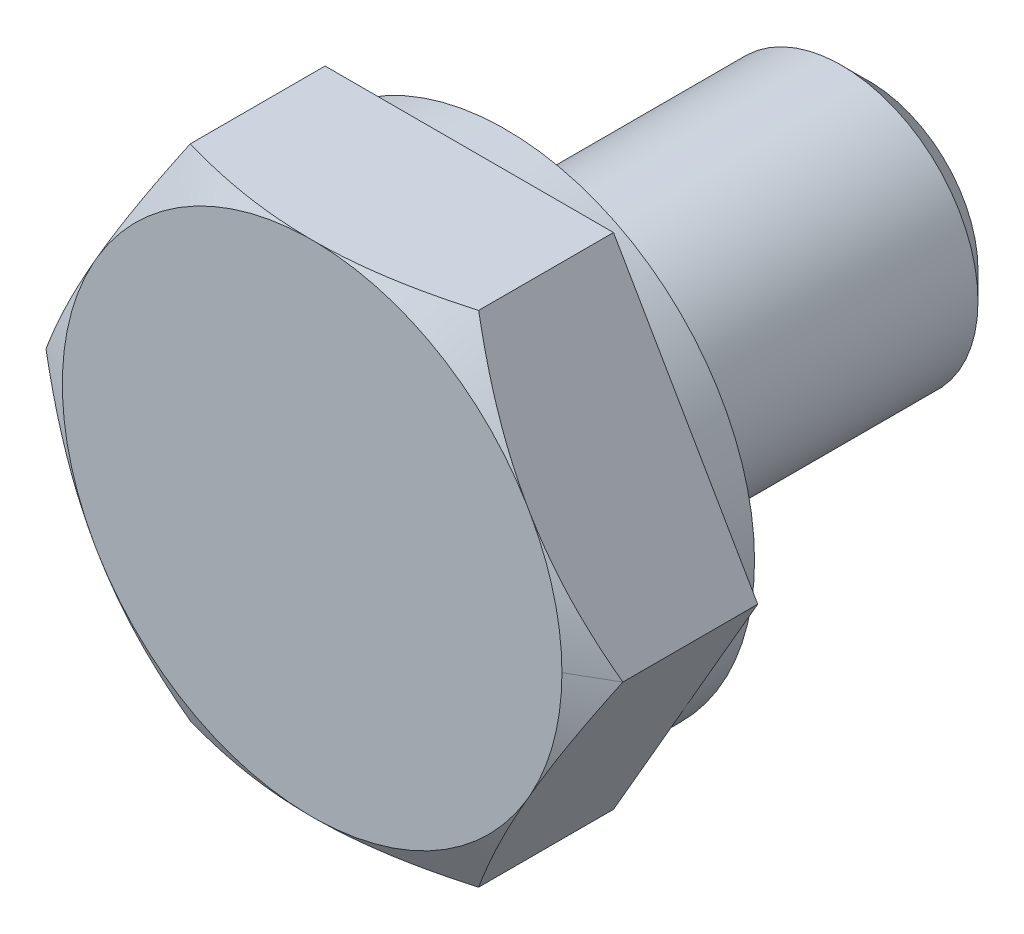
ISO-10303-21;
HEADER;
FILE_DESCRIPTION(('STEP AP214'),'2;1');
FILE_NAME('part.step','',(''),(''),'','','');
FILE_SCHEMA(('AUTOMOTIVE_DESIGN { 1 0 10303 214 1 1 1 1 }'));
ENDSEC;
DATA;
#1=APPLICATION_CONTEXT('core data for automotive mechanical design processes');
#2=APPLICATION_PROTOCOL_DEFINITION('international standard','automotive_design',2000,#1);
#3=PRODUCT_CONTEXT('',#1,'mechanical');
#4=PRODUCT('Part','Part','',(#3));
#5=PRODUCT_RELATED_PRODUCT_CATEGORY('part','',(#4));
#6=PRODUCT_DEFINITION_FORMATION('','',#4);
#7=PRODUCT_DEFINITION_CONTEXT('part definition',#1,'design');
#8=PRODUCT_DEFINITION('design','',#6,#7);
#9=PRODUCT_DEFINITION_SHAPE('','',#8);
#10=(LENGTH_UNIT() NAMED_UNIT(*) SI_UNIT(.MILLI.,.METRE.));
#11=(NAMED_UNIT(*) PLANE_ANGLE_UNIT() SI_UNIT($,.RADIAN.));
#12=(NAMED_UNIT(*) SI_UNIT($,.STERADIAN.) SOLID_ANGLE_UNIT());
#13=UNCERTAINTY_MEASURE_WITH_UNIT(LENGTH_MEASURE(1.E-05),#10,'distance_accuracy_value','');
#14=(GEOMETRIC_REPRESENTATION_CONTEXT(3) GLOBAL_UNCERTAINTY_ASSIGNED_CONTEXT((#13)) GLOBAL_UNIT_ASSIGNED_CONTEXT((#10,
#11,#12)) REPRESENTATION_CONTEXT('',''));
#15=CARTESIAN_POINT('',(0.,0.,0.));
#16=DIRECTION('',(0.,0.,1.));
#17=DIRECTION('',(1.,0.,0.));
#18=AXIS2_PLACEMENT_3D('',#15,#16,#17);
#19=CARTESIAN_POINT('',(0.,0.,2.13));
#20=DIRECTION('',(0.,0.,-1.));
#21=DIRECTION('',(1.,0.,0.));
#22=AXIS2_PLACEMENT_3D('',#19,#20,#21);
#23=CONICAL_SURFACE('',#22,2.75,1.047197551197);
#24=CARTESIAN_POINT('',(3.17500000000077,4.31876756579186E-13,1.88462613559356));
#25=CARTESIAN_POINT('',(2.76173272710988,-0.715799913751664,2.1232261068445));
#26=CARTESIAN_POINT('',(2.40378469547216,-1.33578409101713,2.12999999999952));
#27=(BOUNDED_CURVE() B_SPLINE_CURVE(2,(#24,#25,#26),.UNSPECIFIED.,.F.,
.F.) B_SPLINE_CURVE_WITH_KNOTS((3,3),(0.,1.),
.UNSPECIFIED.) CURVE() GEOMETRIC_REPRESENTATION_ITEM() RATIONAL_B_SPLINE_CURVE((1.,
1.03571044550834,1.)) REPRESENTATION_ITEM(''));
#28=CARTESIAN_POINT('',(3.175,0.,1.884626135594));
#29=VERTEX_POINT('',#28);
#30=CARTESIAN_POINT('',(2.403784695472,-1.335784091018,2.13));
#31=VERTEX_POINT('',#30);
#32=EDGE_CURVE('E268',#29,#31,#27,.T.);
#33=ORIENTED_EDGE('',*,*,#32,.F.);
#34=DIRECTION('',(0.866025403784329,0.,-0.50000000000019));
#35=VECTOR('',#34,1.);
#36=CARTESIAN_POINT('',(2.75,0.,2.13));
#37=LINE('',#36,#35);
#38=CARTESIAN_POINT('',(2.75,0.,2.13));
#39=VERTEX_POINT('',#38);
#40=EDGE_CURVE('E11',#39,#29,#37,.T.);
#41=ORIENTED_EDGE('',*,*,#40,.F.);
#42=CARTESIAN_POINT('',(0.,0.,2.13));
#43=DIRECTION('',(0.,0.,1.));
#44=DIRECTION('',(1.,0.,0.));
#45=AXIS2_PLACEMENT_3D('',#42,#43,#44);
#46=CIRCLE('',#45,2.75);
#47=EDGE_CURVE('E196',#31,#39,#46,.T.);
#48=ORIENTED_EDGE('',*,*,#47,.F.);
#49=EDGE_LOOP('',(#33,#41,#48));
#50=FACE_BOUND('',#49,.T.);
#51=ADVANCED_FACE('F16',(#50),#23,.T.);
#52=CARTESIAN_POINT('',(0.,0.,2.13));
#53=DIRECTION('',(0.,0.,-1.));
#54=DIRECTION('',(1.,0.,0.));
#55=AXIS2_PLACEMENT_3D('',#52,#53,#54);
#56=CONICAL_SURFACE('',#55,2.75,1.047197551197);
#57=CARTESIAN_POINT('',(1.5875,-2.749630657016,1.88462613559401));
#58=CARTESIAN_POINT('',(0.760965454218971,-2.749630657016,2.12322610684454));
#59=CARTESIAN_POINT('',(0.0450693909440477,-2.749630657016,2.12999999999952));
#60=(BOUNDED_CURVE() B_SPLINE_CURVE(2,(#57,#58,#59),.UNSPECIFIED.,.F.,
.F.) B_SPLINE_CURVE_WITH_KNOTS((3,3),(0.,1.),
.UNSPECIFIED.) CURVE() GEOMETRIC_REPRESENTATION_ITEM() RATIONAL_B_SPLINE_CURVE((1.,
1.0357104455083,1.)) REPRESENTATION_ITEM(''));
#61=CARTESIAN_POINT('',(1.5875,-2.749630657016,1.884626135594));
#62=VERTEX_POINT('',#61);
#63=CARTESIAN_POINT('',(0.04506939094322,-2.749630657016,2.13));
#64=VERTEX_POINT('',#63);
#65=EDGE_CURVE('E248',#62,#64,#60,.T.);
#66=ORIENTED_EDGE('',*,*,#65,.F.);
#67=CARTESIAN_POINT('',(2.35871530452865,-1.41384656599745,2.12999999999953));
#68=CARTESIAN_POINT('',(2.00076727289077,-2.03383074326322,2.12322610684475));
#69=CARTESIAN_POINT('',(1.58749999999974,-2.74963065701555,1.88462613559386));
#70=(BOUNDED_CURVE() B_SPLINE_CURVE(2,(#67,#68,#69),.UNSPECIFIED.,.F.,
.F.) B_SPLINE_CURVE_WITH_KNOTS((3,3),(0.,1.),
.UNSPECIFIED.) CURVE() GEOMETRIC_REPRESENTATION_ITEM() RATIONAL_B_SPLINE_CURVE((1.,
1.03571044550838,1.)) REPRESENTATION_ITEM(''));
#71=CARTESIAN_POINT('',(2.358715304528,-1.413846565998,2.13));
#72=VERTEX_POINT('',#71);
#73=EDGE_CURVE('E267',#72,#62,#70,.T.);
#74=ORIENTED_EDGE('',*,*,#73,.F.);
#75=CARTESIAN_POINT('',(0.,0.,2.13));
#76=DIRECTION('',(0.,0.,1.));
#77=DIRECTION('',(1.,0.,0.));
#78=AXIS2_PLACEMENT_3D('',#75,#76,#77);
#79=CIRCLE('',#78,2.75);
#80=EDGE_CURVE('E203',#64,#72,#79,.T.);
#81=ORIENTED_EDGE('',*,*,#80,.F.);
#82=EDGE_LOOP('',(#66,#74,#81));
#83=FACE_BOUND('',#82,.T.);
#84=ADVANCED_FACE('F432',(#83),#56,.T.);
#85=CARTESIAN_POINT('',(0.,0.,2.13));
#86=DIRECTION('',(0.,0.,-1.));
#87=DIRECTION('',(1.,0.,0.));
#88=AXIS2_PLACEMENT_3D('',#85,#86,#87);
#89=CONICAL_SURFACE('',#88,2.75,1.047197551197);
#90=CARTESIAN_POINT('',(0.,0.,2.13));
#91=DIRECTION('',(0.,0.,1.));
#92=DIRECTION('',(1.,0.,0.));
#93=AXIS2_PLACEMENT_3D('',#90,#91,#92);
#94=CIRCLE('',#93,2.75);
#95=CARTESIAN_POINT('',(-2.358715304528,-1.413846565998,2.13));
#96=VERTEX_POINT('',#95);
#97=CARTESIAN_POINT('',(-0.04506939094342,-2.749630657016,2.13));
#98=VERTEX_POINT('',#97);
#99=EDGE_CURVE('E226',#96,#98,#94,.T.);
#100=ORIENTED_EDGE('',*,*,#99,.F.);
#101=CARTESIAN_POINT('',(-1.58749999999923,-2.74963065701643,1.88462613559356));
#102=CARTESIAN_POINT('',(-2.00076727289012,-2.03383074326434,2.1232261068445));
#103=CARTESIAN_POINT('',(-2.35871530452784,-1.41384656599886,2.12999999999952));
#104=(BOUNDED_CURVE() B_SPLINE_CURVE(2,(#101,#102,#103),.UNSPECIFIED.,.F.,
.F.) B_SPLINE_CURVE_WITH_KNOTS((3,3),(0.,1.),
.UNSPECIFIED.) CURVE() GEOMETRIC_REPRESENTATION_ITEM() RATIONAL_B_SPLINE_CURVE((1.,
1.03571044550834,1.)) REPRESENTATION_ITEM(''));
#105=CARTESIAN_POINT('',(-1.5875,-2.749630657016,1.884626135594));
#106=VERTEX_POINT('',#105);
#107=EDGE_CURVE('E272',#106,#96,#104,.T.);
#108=ORIENTED_EDGE('',*,*,#107,.F.);
#109=CARTESIAN_POINT('',(-0.0450693909426159,-2.749630657016,2.12999999999953));
#110=CARTESIAN_POINT('',(-0.760965454218211,-2.749630657016,2.12322610684477));
#111=CARTESIAN_POINT('',(-1.5875,-2.749630657016,1.88462613559401));
#112=(BOUNDED_CURVE() B_SPLINE_CURVE(2,(#109,#110,#111),.UNSPECIFIED.,.F.,
.F.) B_SPLINE_CURVE_WITH_KNOTS((3,3),(0.,1.),
.UNSPECIFIED.) CURVE() GEOMETRIC_REPRESENTATION_ITEM() RATIONAL_B_SPLINE_CURVE((1.,
1.03571044550838,1.)) REPRESENTATION_ITEM(''));
#113=EDGE_CURVE('E342',#98,#106,#112,.T.);
#114=ORIENTED_EDGE('',*,*,#113,.F.);
#115=EDGE_LOOP('',(#100,#108,#114));
#116=FACE_BOUND('',#115,.T.);
#117=ADVANCED_FACE('F412',(#116),#89,.T.);
#118=CARTESIAN_POINT('',(0.,0.,2.13));
#119=DIRECTION('',(0.,0.,-1.));
#120=DIRECTION('',(1.,0.,0.));
#121=AXIS2_PLACEMENT_3D('',#118,#119,#120);
#122=CONICAL_SURFACE('',#121,2.75,1.047197551197);
#123=CARTESIAN_POINT('',(0.,0.,2.13));
#124=DIRECTION('',(0.,0.,1.));
#125=DIRECTION('',(1.,0.,0.));
#126=AXIS2_PLACEMENT_3D('',#123,#124,#125);
#127=CIRCLE('',#126,2.75);
#128=CARTESIAN_POINT('',(-2.403784695472,1.335784091018,2.13));
#129=VERTEX_POINT('',#128);
#130=CARTESIAN_POINT('',(-2.403784695472,-1.335784091018,2.13));
#131=VERTEX_POINT('',#130);
#132=EDGE_CURVE('E229',#129,#131,#127,.T.);
#133=ORIENTED_EDGE('',*,*,#132,.F.);
#134=CARTESIAN_POINT('',(-3.1750000000007,-3.09086090055644E-13,1.88462613559361));
#135=CARTESIAN_POINT('',(-2.76173272710985,0.715799913751714,2.1232261068445));
#136=CARTESIAN_POINT('',(-2.40378469547216,1.33578409101713,2.12999999999952));
#137=(BOUNDED_CURVE() B_SPLINE_CURVE(2,(#134,#135,#136),.UNSPECIFIED.,.F.,
.F.) B_SPLINE_CURVE_WITH_KNOTS((3,3),(0.,1.),
.UNSPECIFIED.) CURVE() GEOMETRIC_REPRESENTATION_ITEM() RATIONAL_B_SPLINE_CURVE((1.,
1.03571044550834,1.)) REPRESENTATION_ITEM(''));
#138=CARTESIAN_POINT('',(-3.175,0.,1.884626135594));
#139=VERTEX_POINT('',#138);
#140=EDGE_CURVE('E20',#139,#129,#137,.T.);
#141=ORIENTED_EDGE('',*,*,#140,.F.);
#142=CARTESIAN_POINT('',(-2.40378469547135,-1.33578409101855,2.12999999999953));
#143=CARTESIAN_POINT('',(-2.76173272710925,-0.715799913752766,2.12322610684475));
#144=CARTESIAN_POINT('',(-3.17500000000028,-4.03233002543857E-13,1.88462613559384));
#145=(BOUNDED_CURVE() B_SPLINE_CURVE(2,(#142,#143,#144),.UNSPECIFIED.,.F.,
.F.) B_SPLINE_CURVE_WITH_KNOTS((3,3),(0.,1.),
.UNSPECIFIED.) CURVE() GEOMETRIC_REPRESENTATION_ITEM() RATIONAL_B_SPLINE_CURVE((1.,
1.03571044550837,1.)) REPRESENTATION_ITEM(''));
#146=EDGE_CURVE('E239',#131,#139,#145,.T.);
#147=ORIENTED_EDGE('',*,*,#146,.F.);
#148=EDGE_LOOP('',(#133,#141,#147));
#149=FACE_BOUND('',#148,.T.);
#150=ADVANCED_FACE('F420',(#149),#122,.T.);
#151=CARTESIAN_POINT('',(0.,0.,2.13));
#152=DIRECTION('',(0.,0.,-1.));
#153=DIRECTION('',(1.,0.,0.));
#154=AXIS2_PLACEMENT_3D('',#151,#152,#153);
#155=CONICAL_SURFACE('',#154,2.75,1.047197551197);
#156=CARTESIAN_POINT('',(0.,0.,2.13));
#157=DIRECTION('',(0.,0.,1.));
#158=DIRECTION('',(1.,0.,0.));
#159=AXIS2_PLACEMENT_3D('',#156,#157,#158);
#160=CIRCLE('',#159,2.75);
#161=CARTESIAN_POINT('',(-0.04506939094341,2.749630657016,2.13));
#162=VERTEX_POINT('',#161);
#163=CARTESIAN_POINT('',(-2.358715304528,1.413846565998,2.13));
#164=VERTEX_POINT('',#163);
#165=EDGE_CURVE('E124',#162,#164,#160,.T.);
#166=ORIENTED_EDGE('',*,*,#165,.F.);
#167=CARTESIAN_POINT('',(-1.5875,2.749630657016,1.88462613559401));
#168=CARTESIAN_POINT('',(-0.760965454219075,2.749630657016,2.12322610684451));
#169=CARTESIAN_POINT('',(-0.0450693909442407,2.749630657016,2.12999999999952));
#170=(BOUNDED_CURVE() B_SPLINE_CURVE(2,(#167,#168,#169),.UNSPECIFIED.,.F.,
.F.) B_SPLINE_CURVE_WITH_KNOTS((3,3),(0.,1.),
.UNSPECIFIED.) CURVE() GEOMETRIC_REPRESENTATION_ITEM() RATIONAL_B_SPLINE_CURVE((1.,
1.03571044550827,1.)) REPRESENTATION_ITEM(''));
#171=CARTESIAN_POINT('',(-1.5875,2.749630657016,1.884626135594));
#172=VERTEX_POINT('',#171);
#173=EDGE_CURVE('E207',#172,#162,#170,.T.);
#174=ORIENTED_EDGE('',*,*,#173,.F.);
#175=CARTESIAN_POINT('',(-2.35871530452865,1.41384656599745,2.12999999999953));
#176=CARTESIAN_POINT('',(-2.00076727289077,2.03383074326322,2.12322610684475));
#177=CARTESIAN_POINT('',(-1.58749999999974,2.74963065701555,1.88462613559386));
#178=(BOUNDED_CURVE() B_SPLINE_CURVE(2,(#175,#176,#177),.UNSPECIFIED.,.F.,
.F.) B_SPLINE_CURVE_WITH_KNOTS((3,3),(0.,1.),
.UNSPECIFIED.) CURVE() GEOMETRIC_REPRESENTATION_ITEM() RATIONAL_B_SPLINE_CURVE((1.,
1.03571044550838,1.)) REPRESENTATION_ITEM(''));
#179=EDGE_CURVE('E232',#164,#172,#178,.T.);
#180=ORIENTED_EDGE('',*,*,#179,.F.);
#181=EDGE_LOOP('',(#166,#174,#180));
#182=FACE_BOUND('',#181,.T.);
#183=ADVANCED_FACE('F506',(#182),#155,.T.);
#184=CARTESIAN_POINT('',(0.,0.,2.13));
#185=DIRECTION('',(0.,0.,-1.));
#186=DIRECTION('',(1.,0.,0.));
#187=AXIS2_PLACEMENT_3D('',#184,#185,#186);
#188=CONICAL_SURFACE('',#187,2.75,1.047197551197);
#189=CARTESIAN_POINT('',(2.40378469547135,1.33578409101855,2.12999999999953));
#190=CARTESIAN_POINT('',(2.76173272710923,0.715799913752781,2.12322610684475));
#191=CARTESIAN_POINT('',(3.17500000000026,4.44089209850063E-13,1.88462613559386));
#192=(BOUNDED_CURVE() B_SPLINE_CURVE(2,(#189,#190,#191),.UNSPECIFIED.,.F.,
.F.) B_SPLINE_CURVE_WITH_KNOTS((3,3),(0.,1.),
.UNSPECIFIED.) CURVE() GEOMETRIC_REPRESENTATION_ITEM() RATIONAL_B_SPLINE_CURVE((1.,
1.03571044550837,1.)) REPRESENTATION_ITEM(''));
#193=CARTESIAN_POINT('',(2.403784695472,1.335784091018,2.13));
#194=VERTEX_POINT('',#193);
#195=EDGE_CURVE('E212',#194,#29,#192,.T.);
#196=ORIENTED_EDGE('',*,*,#195,.F.);
#197=CARTESIAN_POINT('',(0.,0.,2.13));
#198=DIRECTION('',(0.,0.,1.));
#199=DIRECTION('',(1.,0.,0.));
#200=AXIS2_PLACEMENT_3D('',#197,#198,#199);
#201=CIRCLE('',#200,2.75);
#202=EDGE_CURVE('E29',#39,#194,#201,.T.);
#203=ORIENTED_EDGE('',*,*,#202,.F.);
#204=ORIENTED_EDGE('',*,*,#40,.T.);
#205=EDGE_LOOP('',(#196,#203,#204));
#206=FACE_BOUND('',#205,.T.);
#207=ADVANCED_FACE('F387',(#206),#188,.T.);
#208=CARTESIAN_POINT('',(0.,0.,2.13));
#209=DIRECTION('',(0.,0.,1.));
#210=DIRECTION('',(1.,0.,0.));
#211=AXIS2_PLACEMENT_3D('',#208,#209,#210);
#212=PLANE('',#211);
#213=DIRECTION('',(-0.50000000000019,0.866025403784329,0.));
#214=VECTOR('',#213,1.);
#215=CARTESIAN_POINT('',(3.175,0.,2.13));
#216=LINE('',#215,#214);
#217=CARTESIAN_POINT('',(2.358715304528,1.413846565998,2.13));
#218=VERTEX_POINT('',#217);
#219=EDGE_CURVE('E176',#194,#218,#216,.T.);
#220=ORIENTED_EDGE('',*,*,#219,.T.);
#221=CARTESIAN_POINT('',(0.,0.,2.13));
#222=DIRECTION('',(0.,0.,1.));
#223=DIRECTION('',(1.,0.,0.));
#224=AXIS2_PLACEMENT_3D('',#221,#222,#223);
#225=CIRCLE('',#224,2.75);
#226=CARTESIAN_POINT('',(0.04506939094322,2.749630657016,2.13));
#227=VERTEX_POINT('',#226);
#228=EDGE_CURVE('E107',#218,#227,#225,.T.);
#229=ORIENTED_EDGE('',*,*,#228,.T.);
#230=DIRECTION('',(-1.,0.,0.));
#231=VECTOR('',#230,1.);
#232=CARTESIAN_POINT('',(1.5875,2.749630657016,2.13));
#233=LINE('',#232,#231);
#234=EDGE_CURVE('E165',#227,#162,#233,.T.);
#235=ORIENTED_EDGE('',*,*,#234,.T.);
#236=ORIENTED_EDGE('',*,*,#165,.T.);
#237=DIRECTION('',(-0.50000000000019,-0.866025403784329,0.));
#238=VECTOR('',#237,1.);
#239=CARTESIAN_POINT('',(-1.5875,2.749630657016,2.13));
#240=LINE('',#239,#238);
#241=EDGE_CURVE('E238',#164,#129,#240,.T.);
#242=ORIENTED_EDGE('',*,*,#241,.T.);
#243=ORIENTED_EDGE('',*,*,#132,.T.);
#244=DIRECTION('',(0.50000000000019,-0.866025403784329,0.));
#245=VECTOR('',#244,1.);
#246=CARTESIAN_POINT('',(-3.175,0.,2.13));
#247=LINE('',#246,#245);
#248=EDGE_CURVE('E247',#131,#96,#247,.T.);
#249=ORIENTED_EDGE('',*,*,#248,.T.);
#250=ORIENTED_EDGE('',*,*,#99,.T.);
#251=DIRECTION('',(1.,0.,0.));
#252=VECTOR('',#251,1.);
#253=CARTESIAN_POINT('',(-1.5875,-2.749630657016,2.13));
#254=LINE('',#253,#252);
#255=EDGE_CURVE('E257',#98,#64,#254,.T.);
#256=ORIENTED_EDGE('',*,*,#255,.T.);
#257=ORIENTED_EDGE('',*,*,#80,.T.);
#258=DIRECTION('',(0.50000000000019,0.866025403784329,0.));
#259=VECTOR('',#258,1.);
#260=CARTESIAN_POINT('',(1.5875,-2.749630657016,2.13));
#261=LINE('',#260,#259);
#262=EDGE_CURVE('E263',#72,#31,#261,.T.);
#263=ORIENTED_EDGE('',*,*,#262,.T.);
#264=ORIENTED_EDGE('',*,*,#47,.T.);
#265=ORIENTED_EDGE('',*,*,#202,.T.);
#266=EDGE_LOOP('',(#220,#229,#235,#236,#242,#243,#249,#250,#256,#257,#263,#264,#265));
#267=FACE_BOUND('',#266,.T.);
#268=ADVANCED_FACE('F384',(#267),#212,.T.);
#269=CARTESIAN_POINT('',(0.,0.,2.13));
#270=DIRECTION('',(0.,0.,-1.));
#271=DIRECTION('',(1.,0.,0.));
#272=AXIS2_PLACEMENT_3D('',#269,#270,#271);
#273=CONICAL_SURFACE('',#272,2.75,1.047197551197);
#274=CARTESIAN_POINT('',(0.0450693909424189,2.749630657016,2.12999999999953));
#275=CARTESIAN_POINT('',(0.760965454218106,2.749630657016,2.1232261068448));
#276=CARTESIAN_POINT('',(1.5875,2.749630657016,1.88462613559401));
#277=(BOUNDED_CURVE() B_SPLINE_CURVE(2,(#274,#275,#276),.UNSPECIFIED.,.F.,
.F.) B_SPLINE_CURVE_WITH_KNOTS((3,3),(0.,1.),
.UNSPECIFIED.) CURVE() GEOMETRIC_REPRESENTATION_ITEM() RATIONAL_B_SPLINE_CURVE((1.,
1.03571044550839,1.)) REPRESENTATION_ITEM(''));
#278=CARTESIAN_POINT('',(1.5875,2.749630657016,1.884626135594));
#279=VERTEX_POINT('',#278);
#280=EDGE_CURVE('E156',#227,#279,#277,.T.);
#281=ORIENTED_EDGE('',*,*,#280,.F.);
#282=ORIENTED_EDGE('',*,*,#228,.F.);
#283=CARTESIAN_POINT('',(1.58749999999923,2.74963065701643,1.88462613559356));
#284=CARTESIAN_POINT('',(2.00076727289012,2.03383074326434,2.1232261068445));
#285=CARTESIAN_POINT('',(2.35871530452784,1.41384656599886,2.12999999999952));
#286=(BOUNDED_CURVE() B_SPLINE_CURVE(2,(#283,#284,#285),.UNSPECIFIED.,.F.,
.F.) B_SPLINE_CURVE_WITH_KNOTS((3,3),(0.,1.),
.UNSPECIFIED.) CURVE() GEOMETRIC_REPRESENTATION_ITEM() RATIONAL_B_SPLINE_CURVE((1.,
1.03571044550834,1.)) REPRESENTATION_ITEM(''));
#287=EDGE_CURVE('E171',#279,#218,#286,.T.);
#288=ORIENTED_EDGE('',*,*,#287,.F.);
#289=EDGE_LOOP('',(#281,#282,#288));
#290=FACE_BOUND('',#289,.T.);
#291=ADVANCED_FACE('F172',(#290),#273,.T.);
#292=CARTESIAN_POINT('',(1.5875,-2.749630657016,0.));
#293=DIRECTION('',(-0.866025403784329,0.50000000000019,0.));
#294=DIRECTION('',(0.,0.,1.));
#295=AXIS2_PLACEMENT_3D('',#292,#293,#294);
#296=PLANE('',#295);
#297=DIRECTION('',(0.,0.,1.));
#298=VECTOR('',#297,1.);
#299=CARTESIAN_POINT('',(3.175,0.,0.4));
#300=LINE('',#299,#298);
#301=CARTESIAN_POINT('',(3.175,0.,0.4));
#302=VERTEX_POINT('',#301);
#303=EDGE_CURVE('E208',#302,#29,#300,.T.);
#304=ORIENTED_EDGE('',*,*,#303,.T.);
#305=ORIENTED_EDGE('',*,*,#32,.T.);
#306=ORIENTED_EDGE('',*,*,#262,.F.);
#307=ORIENTED_EDGE('',*,*,#73,.T.);
#308=DIRECTION('',(0.,0.,1.));
#309=VECTOR('',#308,1.);
#310=CARTESIAN_POINT('',(1.5875,-2.749630657016,0.));
#311=LINE('',#310,#309);
#312=CARTESIAN_POINT('',(1.5875,-2.749630657016,0.4));
#313=VERTEX_POINT('',#312);
#314=EDGE_CURVE('E191',#313,#62,#311,.T.);
#315=ORIENTED_EDGE('',*,*,#314,.F.);
#316=DIRECTION('',(0.50000000000019,0.866025403784329,0.));
#317=VECTOR('',#316,1.);
#318=CARTESIAN_POINT('',(1.984375,-2.062222992762,0.4));
#319=LINE('',#318,#317);
#320=EDGE_CURVE('E301',#313,#302,#319,.T.);
#321=ORIENTED_EDGE('',*,*,#320,.T.);
#322=EDGE_LOOP('',(#304,#305,#306,#307,#315,#321));
#323=FACE_BOUND('',#322,.T.);
#324=ADVANCED_FACE('F388',(#323),#296,.F.);
#325=CARTESIAN_POINT('',(-1.5875,-2.749630657016,0.));
#326=DIRECTION('',(0.,1.,0.));
#327=DIRECTION('',(1.,0.,0.));
#328=AXIS2_PLACEMENT_3D('',#325,#326,#327);
#329=PLANE('',#328);
#330=ORIENTED_EDGE('',*,*,#314,.T.);
#331=ORIENTED_EDGE('',*,*,#65,.T.);
#332=ORIENTED_EDGE('',*,*,#255,.F.);
#333=ORIENTED_EDGE('',*,*,#113,.T.);
#334=DIRECTION('',(0.,0.,1.));
#335=VECTOR('',#334,1.);
#336=CARTESIAN_POINT('',(-1.5875,-2.749630657016,0.));
#337=LINE('',#336,#335);
#338=CARTESIAN_POINT('',(-1.5875,-2.749630657016,0.4));
#339=VERTEX_POINT('',#338);
#340=EDGE_CURVE('E237',#339,#106,#337,.T.);
#341=ORIENTED_EDGE('',*,*,#340,.F.);
#342=DIRECTION('',(1.,0.,0.));
#343=VECTOR('',#342,1.);
#344=CARTESIAN_POINT('',(-0.79375,-2.749630657016,0.4));
#345=LINE('',#344,#343);
#346=EDGE_CURVE('E281',#339,#313,#345,.T.);
#347=ORIENTED_EDGE('',*,*,#346,.T.);
#348=EDGE_LOOP('',(#330,#331,#332,#333,#341,#347));
#349=FACE_BOUND('',#348,.T.);
#350=ADVANCED_FACE('F426',(#349),#329,.F.);
#351=CARTESIAN_POINT('',(-3.175,0.,0.));
#352=DIRECTION('',(0.866025403784329,0.50000000000019,0.));
#353=DIRECTION('',(0.,0.,-1.));
#354=AXIS2_PLACEMENT_3D('',#351,#352,#353);
#355=PLANE('',#354);
#356=ORIENTED_EDGE('',*,*,#340,.T.);
#357=ORIENTED_EDGE('',*,*,#107,.T.);
#358=ORIENTED_EDGE('',*,*,#248,.F.);
#359=ORIENTED_EDGE('',*,*,#146,.T.);
#360=DIRECTION('',(0.,0.,1.));
#361=VECTOR('',#360,1.);
#362=CARTESIAN_POINT('',(-3.175,0.,0.));
#363=LINE('',#362,#361);
#364=CARTESIAN_POINT('',(-3.175,0.,0.4));
#365=VERTEX_POINT('',#364);
#366=EDGE_CURVE('E168',#365,#139,#363,.T.);
#367=ORIENTED_EDGE('',*,*,#366,.F.);
#368=DIRECTION('',(0.50000000000019,-0.866025403784329,0.));
#369=VECTOR('',#368,1.);
#370=CARTESIAN_POINT('',(-2.778125,-0.687407664254,0.4));
#371=LINE('',#370,#369);
#372=EDGE_CURVE('E277',#365,#339,#371,.T.);
#373=ORIENTED_EDGE('',*,*,#372,.T.);
#374=EDGE_LOOP('',(#356,#357,#358,#359,#367,#373));
#375=FACE_BOUND('',#374,.T.);
#376=ADVANCED_FACE('F410',(#375),#355,.F.);
#377=CARTESIAN_POINT('',(-1.5875,2.749630657016,0.));
#378=DIRECTION('',(0.866025403784329,-0.50000000000019,0.));
#379=DIRECTION('',(0.,0.,-1.));
#380=AXIS2_PLACEMENT_3D('',#377,#378,#379);
#381=PLANE('',#380);
#382=ORIENTED_EDGE('',*,*,#366,.T.);
#383=ORIENTED_EDGE('',*,*,#140,.T.);
#384=ORIENTED_EDGE('',*,*,#241,.F.);
#385=ORIENTED_EDGE('',*,*,#179,.T.);
#386=DIRECTION('',(0.,0.,1.));
#387=VECTOR('',#386,1.);
#388=CARTESIAN_POINT('',(-1.5875,2.749630657016,0.));
#389=LINE('',#388,#387);
#390=CARTESIAN_POINT('',(-1.5875,2.749630657016,0.4));
#391=VERTEX_POINT('',#390);
#392=EDGE_CURVE('E204',#391,#172,#389,.T.);
#393=ORIENTED_EDGE('',*,*,#392,.F.);
#394=DIRECTION('',(-0.50000000000019,-0.866025403784329,0.));
#395=VECTOR('',#394,1.);
#396=CARTESIAN_POINT('',(-1.984375,2.062222992762,0.4));
#397=LINE('',#396,#395);
#398=EDGE_CURVE('E188',#391,#365,#397,.T.);
#399=ORIENTED_EDGE('',*,*,#398,.T.);
#400=EDGE_LOOP('',(#382,#383,#384,#385,#393,#399));
#401=FACE_BOUND('',#400,.T.);
#402=ADVANCED_FACE('F423',(#401),#381,.F.);
#403=CARTESIAN_POINT('',(1.5875,2.749630657016,0.));
#404=DIRECTION('',(0.,-1.,0.));
#405=DIRECTION('',(-1.,0.,0.));
#406=AXIS2_PLACEMENT_3D('',#403,#404,#405);
#407=PLANE('',#406);
#408=ORIENTED_EDGE('',*,*,#392,.T.);
#409=ORIENTED_EDGE('',*,*,#173,.T.);
#410=ORIENTED_EDGE('',*,*,#234,.F.);
#411=ORIENTED_EDGE('',*,*,#280,.T.);
#412=DIRECTION('',(0.,0.,1.));
#413=VECTOR('',#412,1.);
#414=CARTESIAN_POINT('',(1.5875,2.749630657016,0.));
#415=LINE('',#414,#413);
#416=CARTESIAN_POINT('',(1.5875,2.749630657016,0.4));
#417=VERTEX_POINT('',#416);
#418=EDGE_CURVE('E162',#417,#279,#415,.T.);
#419=ORIENTED_EDGE('',*,*,#418,.F.);
#420=DIRECTION('',(-1.,0.,0.));
#421=VECTOR('',#420,1.);
#422=CARTESIAN_POINT('',(0.79375,2.749630657016,0.4));
#423=LINE('',#422,#421);
#424=EDGE_CURVE('E183',#417,#391,#423,.T.);
#425=ORIENTED_EDGE('',*,*,#424,.T.);
#426=EDGE_LOOP('',(#408,#409,#410,#411,#419,#425));
#427=FACE_BOUND('',#426,.T.);
#428=ADVANCED_FACE('F159',(#427),#407,.F.);
#429=CARTESIAN_POINT('',(3.175,0.,0.));
#430=DIRECTION('',(-0.866025403784329,-0.50000000000019,0.));
#431=DIRECTION('',(-0.50000000000019,0.866025403784329,0.));
#432=AXIS2_PLACEMENT_3D('',#429,#430,#431);
#433=PLANE('',#432);
#434=ORIENTED_EDGE('',*,*,#418,.T.);
#435=ORIENTED_EDGE('',*,*,#287,.T.);
#436=ORIENTED_EDGE('',*,*,#219,.F.);
#437=ORIENTED_EDGE('',*,*,#195,.T.);
#438=ORIENTED_EDGE('',*,*,#303,.F.);
#439=DIRECTION('',(-0.50000000000019,0.866025403784329,0.));
#440=VECTOR('',#439,1.);
#441=CARTESIAN_POINT('',(2.778125,0.687407664254,0.4));
#442=LINE('',#441,#440);
#443=EDGE_CURVE('E181',#302,#417,#442,.T.);
#444=ORIENTED_EDGE('',*,*,#443,.T.);
#445=EDGE_LOOP('',(#434,#435,#436,#437,#438,#444));
#446=FACE_BOUND('',#445,.T.);
#447=ADVANCED_FACE('F179',(#446),#433,.F.);
#448=CARTESIAN_POINT('',(0.,0.,0.4));
#449=DIRECTION('',(0.,0.,1.));
#450=DIRECTION('',(1.,0.,0.));
#451=AXIS2_PLACEMENT_3D('',#448,#449,#450);
#452=PLANE('',#451);
#453=CARTESIAN_POINT('',(0.,0.,0.4));
#454=DIRECTION('',(0.,0.,1.));
#455=DIRECTION('',(1.,0.,0.));
#456=AXIS2_PLACEMENT_3D('',#453,#454,#455);
#457=CIRCLE('',#456,2.74);
#458=CARTESIAN_POINT('',(2.74,0.,0.4));
#459=VERTEX_POINT('',#458);
#460=EDGE_CURVE('E273',#459,#459,#457,.T.);
#461=ORIENTED_EDGE('',*,*,#460,.T.);
#462=EDGE_LOOP('',(#461));
#463=FACE_BOUND('',#462,.T.);
#464=ORIENTED_EDGE('',*,*,#443,.F.);
#465=ORIENTED_EDGE('',*,*,#320,.F.);
#466=ORIENTED_EDGE('',*,*,#346,.F.);
#467=ORIENTED_EDGE('',*,*,#372,.F.);
#468=ORIENTED_EDGE('',*,*,#398,.F.);
#469=ORIENTED_EDGE('',*,*,#424,.F.);
#470=EDGE_LOOP('',(#464,#465,#466,#467,#468,#469));
#471=FACE_BOUND('',#470,.T.);
#472=ADVANCED_FACE('F393',(#463,#471),#452,.F.);
#473=CARTESIAN_POINT('',(0.,0.,0.));
#474=DIRECTION('',(0.,0.,1.));
#475=DIRECTION('',(1.,0.,0.));
#476=AXIS2_PLACEMENT_3D('',#473,#474,#475);
#477=CYLINDRICAL_SURFACE('',#476,2.74);
#478=CARTESIAN_POINT('',(0.,0.,0.));
#479=DIRECTION('',(0.,0.,1.));
#480=DIRECTION('',(1.,0.,0.));
#481=AXIS2_PLACEMENT_3D('',#478,#479,#480);
#482=CIRCLE('',#481,2.74);
#483=CARTESIAN_POINT('',(2.74,0.,0.));
#484=VERTEX_POINT('',#483);
#485=EDGE_CURVE('E321',#484,#484,#482,.T.);
#486=ORIENTED_EDGE('',*,*,#485,.T.);
#487=DIRECTION('',(0.,0.,1.));
#488=VECTOR('',#487,1.);
#489=CARTESIAN_POINT('',(2.74,0.,0.));
#490=LINE('',#489,#488);
#491=EDGE_CURVE('E276',#484,#459,#490,.T.);
#492=ORIENTED_EDGE('',*,*,#491,.T.);
#493=ORIENTED_EDGE('',*,*,#460,.F.);
#494=ORIENTED_EDGE('',*,*,#491,.F.);
#495=EDGE_LOOP('',(#486,#492,#493,#494));
#496=FACE_BOUND('',#495,.T.);
#497=ADVANCED_FACE('F469',(#496),#477,.T.);
#498=CARTESIAN_POINT('',(0.,0.,0.));
#499=DIRECTION('',(0.,0.,1.));
#500=DIRECTION('',(1.,0.,0.));
#501=AXIS2_PLACEMENT_3D('',#498,#499,#500);
#502=PLANE('',#501);
#503=ORIENTED_EDGE('',*,*,#485,.F.);
#504=EDGE_LOOP('',(#503));
#505=FACE_BOUND('',#504,.T.);
#506=CARTESIAN_POINT('',(0.,0.,0.));
#507=DIRECTION('',(0.,0.,1.));
#508=DIRECTION('',(1.,0.,0.));
#509=AXIS2_PLACEMENT_3D('',#506,#507,#508);
#510=CIRCLE('',#509,1.5);
#511=CARTESIAN_POINT('',(1.5,0.,0.));
#512=VERTEX_POINT('',#511);
#513=EDGE_CURVE('E305',#512,#512,#510,.T.);
#514=ORIENTED_EDGE('',*,*,#513,.T.);
#515=EDGE_LOOP('',(#514));
#516=FACE_BOUND('',#515,.T.);
#517=ADVANCED_FACE('F490',(#505,#516),#502,.F.);
#518=CARTESIAN_POINT('',(0.,0.,-3.7));
#519=DIRECTION('',(0.,0.,1.));
#520=DIRECTION('',(1.,0.,0.));
#521=AXIS2_PLACEMENT_3D('',#518,#519,#520);
#522=CYLINDRICAL_SURFACE('',#521,1.5);
#523=CARTESIAN_POINT('',(0.,0.,-3.7));
#524=DIRECTION('',(0.,0.,1.));
#525=DIRECTION('',(1.,0.,0.));
#526=AXIS2_PLACEMENT_3D('',#523,#524,#525);
#527=CIRCLE('',#526,1.5);
#528=CARTESIAN_POINT('',(1.5,0.,-3.7));
#529=VERTEX_POINT('',#528);
#530=EDGE_CURVE('E282',#529,#529,#527,.T.);
#531=ORIENTED_EDGE('',*,*,#530,.T.);
#532=DIRECTION('',(0.,0.,1.));
#533=VECTOR('',#532,1.);
#534=CARTESIAN_POINT('',(1.5,0.,-3.7));
#535=LINE('',#534,#533);
#536=EDGE_CURVE('E286',#529,#512,#535,.T.);
#537=ORIENTED_EDGE('',*,*,#536,.T.);
#538=ORIENTED_EDGE('',*,*,#513,.F.);
#539=ORIENTED_EDGE('',*,*,#536,.F.);
#540=EDGE_LOOP('',(#531,#537,#538,#539));
#541=FACE_BOUND('',#540,.T.);
#542=ADVANCED_FACE('F446',(#541),#522,.T.);
#543=CARTESIAN_POINT('',(0.,0.,-4.));
#544=DIRECTION('',(0.,0.,1.));
#545=DIRECTION('',(1.,0.,0.));
#546=AXIS2_PLACEMENT_3D('',#543,#544,#545);
#547=CONICAL_SURFACE('',#546,1.2,0.785398163397);
#548=CARTESIAN_POINT('',(0.,0.,-4.));
#549=DIRECTION('',(0.,0.,1.));
#550=DIRECTION('',(1.,0.,0.));
#551=AXIS2_PLACEMENT_3D('',#548,#549,#550);
#552=CIRCLE('',#551,1.2);
#553=CARTESIAN_POINT('',(1.2,0.,-4.));
#554=VERTEX_POINT('',#553);
#555=EDGE_CURVE('E310',#554,#554,#552,.T.);
#556=ORIENTED_EDGE('',*,*,#555,.T.);
#557=DIRECTION('',(0.707106781186548,0.,0.707106781186548));
#558=VECTOR('',#557,1.);
#559=CARTESIAN_POINT('',(1.2,0.,-4.));
#560=LINE('',#559,#558);
#561=EDGE_CURVE('E287',#554,#529,#560,.T.);
#562=ORIENTED_EDGE('',*,*,#561,.T.);
#563=ORIENTED_EDGE('',*,*,#530,.F.);
#564=ORIENTED_EDGE('',*,*,#561,.F.);
#565=EDGE_LOOP('',(#556,#562,#563,#564));
#566=FACE_BOUND('',#565,.T.);
#567=ADVANCED_FACE('F18',(#566),#547,.T.);
#568=CARTESIAN_POINT('',(0.,0.,-4.));
#569=DIRECTION('',(0.,0.,1.));
#570=DIRECTION('',(1.,0.,0.));
#571=AXIS2_PLACEMENT_3D('',#568,#569,#570);
#572=PLANE('',#571);
#573=ORIENTED_EDGE('',*,*,#555,.F.);
#574=EDGE_LOOP('',(#573));
#575=FACE_BOUND('',#574,.T.);
#576=ADVANCED_FACE('F445',(#575),#572,.F.);
#577=CLOSED_SHELL('',(#51,#84,#117,#150,#183,#207,#268,#291,#324,#350,#376,#402,#428,#447,#472,
#497,#517,#542,#567,#576));
#578=MANIFOLD_SOLID_BREP('B1',#577);
#579=ADVANCED_BREP_SHAPE_REPRESENTATION('',(#18,#578),#14);
#580=SHAPE_DEFINITION_REPRESENTATION(#9,#579);
ENDSEC;
END-ISO-10303-21;
